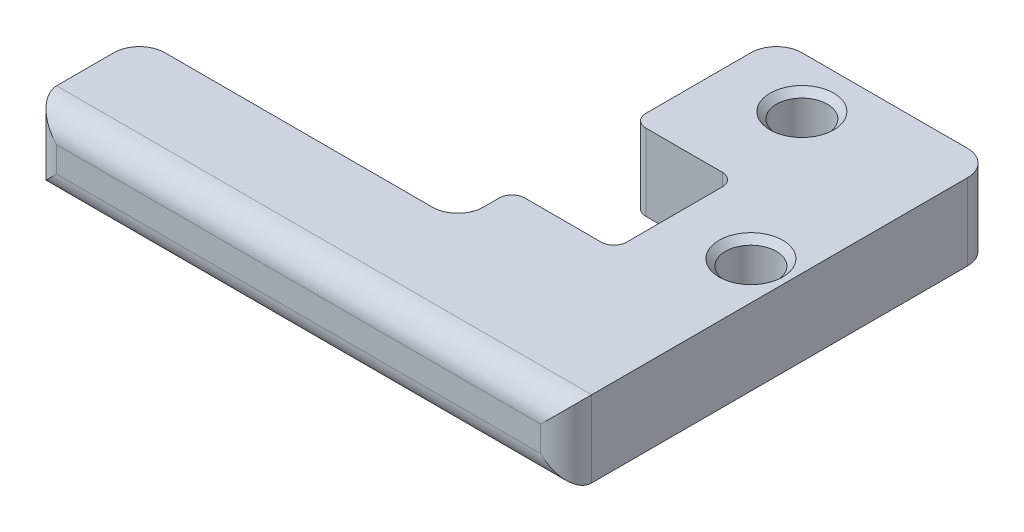
ISO-10303-21;
HEADER;
FILE_DESCRIPTION(('STEP AP214'),'2;1');
FILE_NAME('part.step','',(''),(''),'','','');
FILE_SCHEMA(('AUTOMOTIVE_DESIGN { 1 0 10303 214 1 1 1 1 }'));
ENDSEC;
DATA;
#1=APPLICATION_CONTEXT('core data for automotive mechanical design processes');
#2=APPLICATION_PROTOCOL_DEFINITION('international standard','automotive_design',2000,#1);
#3=PRODUCT_CONTEXT('',#1,'mechanical');
#4=PRODUCT('Part','Part','',(#3));
#5=PRODUCT_RELATED_PRODUCT_CATEGORY('part','',(#4));
#6=PRODUCT_DEFINITION_FORMATION('','',#4);
#7=PRODUCT_DEFINITION_CONTEXT('part definition',#1,'design');
#8=PRODUCT_DEFINITION('design','',#6,#7);
#9=PRODUCT_DEFINITION_SHAPE('','',#8);
#10=(LENGTH_UNIT() NAMED_UNIT(*) SI_UNIT(.MILLI.,.METRE.));
#11=(NAMED_UNIT(*) PLANE_ANGLE_UNIT() SI_UNIT($,.RADIAN.));
#12=(NAMED_UNIT(*) SI_UNIT($,.STERADIAN.) SOLID_ANGLE_UNIT());
#13=UNCERTAINTY_MEASURE_WITH_UNIT(LENGTH_MEASURE(1.E-05),#10,'distance_accuracy_value','');
#14=(GEOMETRIC_REPRESENTATION_CONTEXT(3) GLOBAL_UNCERTAINTY_ASSIGNED_CONTEXT((#13)) GLOBAL_UNIT_ASSIGNED_CONTEXT((#10,
#11,#12)) REPRESENTATION_CONTEXT('',''));
#15=CARTESIAN_POINT('',(0.,0.,0.));
#16=DIRECTION('',(0.,0.,1.));
#17=DIRECTION('',(1.,0.,0.));
#18=AXIS2_PLACEMENT_3D('',#15,#16,#17);
#19=CARTESIAN_POINT('',(-8.5,6.,0.));
#20=DIRECTION('',(1.,0.,0.));
#21=DIRECTION('',(0.,0.,-1.));
#22=AXIS2_PLACEMENT_3D('',#19,#20,#21);
#23=PLANE('',#22);
#24=DIRECTION('',(0.,0.,1.));
#25=VECTOR('',#24,1.);
#26=CARTESIAN_POINT('',(-8.5,6.,0.));
#27=LINE('',#26,#25);
#28=CARTESIAN_POINT('',(-8.5,6.,9.25000000000001));
#29=VERTEX_POINT('',#28);
#30=CARTESIAN_POINT('',(-8.5,6.,10.5));
#31=VERTEX_POINT('',#30);
#32=EDGE_CURVE('E381',#29,#31,#27,.T.);
#33=ORIENTED_EDGE('',*,*,#32,.F.);
#34=DIRECTION('',(0.,1.,0.));
#35=VECTOR('',#34,1.);
#36=CARTESIAN_POINT('',(-8.5,6.,9.25000000000001));
#37=LINE('',#36,#35);
#38=CARTESIAN_POINT('',(-8.5,0.,9.25000000000001));
#39=VERTEX_POINT('',#38);
#40=EDGE_CURVE('E72',#29,#39,#37,.F.);
#41=ORIENTED_EDGE('',*,*,#40,.T.);
#42=DIRECTION('',(0.,0.,1.));
#43=VECTOR('',#42,1.);
#44=CARTESIAN_POINT('',(-8.5,0.,0.));
#45=LINE('',#44,#43);
#46=CARTESIAN_POINT('',(-8.5,0.,10.5));
#47=VERTEX_POINT('',#46);
#48=EDGE_CURVE('E393',#39,#47,#45,.T.);
#49=ORIENTED_EDGE('',*,*,#48,.T.);
#50=DIRECTION('',(0.,-1.,0.));
#51=VECTOR('',#50,1.);
#52=CARTESIAN_POINT('',(-8.5,6.,10.5));
#53=LINE('',#52,#51);
#54=EDGE_CURVE('E244',#47,#31,#53,.F.);
#55=ORIENTED_EDGE('',*,*,#54,.T.);
#56=EDGE_LOOP('',(#33,#41,#49,#55));
#57=FACE_BOUND('',#56,.T.);
#58=ADVANCED_FACE('F49',(#57),#23,.F.);
#59=CARTESIAN_POINT('',(0.,6.,12.5));
#60=DIRECTION('',(0.,0.,1.));
#61=DIRECTION('',(1.,0.,0.));
#62=AXIS2_PLACEMENT_3D('',#59,#60,#61);
#63=PLANE('',#62);
#64=DIRECTION('',(-1.,0.,0.));
#65=VECTOR('',#64,1.);
#66=CARTESIAN_POINT('',(0.,6.,12.5));
#67=LINE('',#66,#65);
#68=CARTESIAN_POINT('',(-10.5,6.,12.5));
#69=VERTEX_POINT('',#68);
#70=CARTESIAN_POINT('',(-31.5,6.,12.5));
#71=VERTEX_POINT('',#70);
#72=EDGE_CURVE('E370',#69,#71,#67,.T.);
#73=ORIENTED_EDGE('',*,*,#72,.F.);
#74=DIRECTION('',(0.,-1.,0.));
#75=VECTOR('',#74,1.);
#76=CARTESIAN_POINT('',(-10.5,0.,12.5));
#77=LINE('',#76,#75);
#78=CARTESIAN_POINT('',(-10.5,0.,12.5));
#79=VERTEX_POINT('',#78);
#80=EDGE_CURVE('E238',#69,#79,#77,.T.);
#81=ORIENTED_EDGE('',*,*,#80,.T.);
#82=DIRECTION('',(-1.,0.,0.));
#83=VECTOR('',#82,1.);
#84=CARTESIAN_POINT('',(0.,0.,12.5));
#85=LINE('',#84,#83);
#86=CARTESIAN_POINT('',(-31.5,0.,12.5));
#87=VERTEX_POINT('',#86);
#88=EDGE_CURVE('E236',#79,#87,#85,.T.);
#89=ORIENTED_EDGE('',*,*,#88,.T.);
#90=DIRECTION('',(0.,-1.,0.));
#91=VECTOR('',#90,1.);
#92=CARTESIAN_POINT('',(-31.5,6.,12.5));
#93=LINE('',#92,#91);
#94=EDGE_CURVE('E229',#87,#71,#93,.F.);
#95=ORIENTED_EDGE('',*,*,#94,.T.);
#96=EDGE_LOOP('',(#73,#81,#89,#95));
#97=FACE_BOUND('',#96,.T.);
#98=ADVANCED_FACE('F436',(#97),#63,.F.);
#99=CARTESIAN_POINT('',(-33.5,6.,0.));
#100=DIRECTION('',(1.,0.,0.));
#101=DIRECTION('',(0.,0.,-1.));
#102=AXIS2_PLACEMENT_3D('',#99,#100,#101);
#103=PLANE('',#102);
#104=DIRECTION('',(0.,0.,1.));
#105=VECTOR('',#104,1.);
#106=CARTESIAN_POINT('',(-33.5,6.,0.));
#107=LINE('',#106,#105);
#108=CARTESIAN_POINT('',(-33.5,6.,14.5));
#109=VERTEX_POINT('',#108);
#110=CARTESIAN_POINT('',(-33.5,6.,19.));
#111=VERTEX_POINT('',#110);
#112=EDGE_CURVE('E373',#109,#111,#107,.T.);
#113=ORIENTED_EDGE('',*,*,#112,.F.);
#114=DIRECTION('',(0.,-1.,0.));
#115=VECTOR('',#114,1.);
#116=CARTESIAN_POINT('',(-33.5,6.,14.5));
#117=LINE('',#116,#115);
#118=CARTESIAN_POINT('',(-33.5,0.,14.5));
#119=VERTEX_POINT('',#118);
#120=EDGE_CURVE('E266',#109,#119,#117,.T.);
#121=ORIENTED_EDGE('',*,*,#120,.T.);
#122=DIRECTION('',(0.,0.,1.));
#123=VECTOR('',#122,1.);
#124=CARTESIAN_POINT('',(-33.5,0.,0.));
#125=LINE('',#124,#123);
#126=CARTESIAN_POINT('',(-33.5,0.,19.));
#127=VERTEX_POINT('',#126);
#128=EDGE_CURVE('E386',#119,#127,#125,.T.);
#129=ORIENTED_EDGE('',*,*,#128,.T.);
#130=DIRECTION('',(0.,-1.,0.));
#131=VECTOR('',#130,1.);
#132=CARTESIAN_POINT('',(-33.5,6.,19.));
#133=LINE('',#132,#131);
#134=EDGE_CURVE('E196',#127,#111,#133,.F.);
#135=ORIENTED_EDGE('',*,*,#134,.T.);
#136=EDGE_LOOP('',(#113,#121,#129,#135));
#137=FACE_BOUND('',#136,.T.);
#138=ADVANCED_FACE('F404',(#137),#103,.F.);
#139=CARTESIAN_POINT('',(0.,6.,21.));
#140=DIRECTION('',(0.,0.,1.));
#141=DIRECTION('',(1.,0.,0.));
#142=AXIS2_PLACEMENT_3D('',#139,#140,#141);
#143=PLANE('',#142);
#144=DIRECTION('',(-1.,0.,0.));
#145=VECTOR('',#144,1.);
#146=CARTESIAN_POINT('',(0.,4.,21.));
#147=LINE('',#146,#145);
#148=CARTESIAN_POINT('',(6.5,4.,21.));
#149=VERTEX_POINT('',#148);
#150=CARTESIAN_POINT('',(-31.5,4.,21.));
#151=VERTEX_POINT('',#150);
#152=EDGE_CURVE('E214',#149,#151,#147,.T.);
#153=ORIENTED_EDGE('',*,*,#152,.T.);
#154=DIRECTION('',(0.,-1.,0.));
#155=VECTOR('',#154,1.);
#156=CARTESIAN_POINT('',(-31.5,0.,21.));
#157=LINE('',#156,#155);
#158=CARTESIAN_POINT('',(-31.5,2.,21.));
#159=VERTEX_POINT('',#158);
#160=EDGE_CURVE('E194',#151,#159,#157,.T.);
#161=ORIENTED_EDGE('',*,*,#160,.T.);
#162=DIRECTION('',(-1.,0.,0.));
#163=VECTOR('',#162,1.);
#164=CARTESIAN_POINT('',(8.5,2.,21.));
#165=LINE('',#164,#163);
#166=CARTESIAN_POINT('',(6.5,2.,21.));
#167=VERTEX_POINT('',#166);
#168=EDGE_CURVE('E203',#159,#167,#165,.F.);
#169=ORIENTED_EDGE('',*,*,#168,.T.);
#170=DIRECTION('',(0.,-1.,0.));
#171=VECTOR('',#170,1.);
#172=CARTESIAN_POINT('',(6.5,6.,21.));
#173=LINE('',#172,#171);
#174=EDGE_CURVE('E209',#167,#149,#173,.F.);
#175=ORIENTED_EDGE('',*,*,#174,.T.);
#176=EDGE_LOOP('',(#153,#161,#169,#175));
#177=FACE_BOUND('',#176,.T.);
#178=ADVANCED_FACE('F212',(#177),#143,.T.);
#179=CARTESIAN_POINT('',(8.50000000000001,6.,0.));
#180=DIRECTION('',(1.,0.,0.));
#181=DIRECTION('',(0.,0.,-1.));
#182=AXIS2_PLACEMENT_3D('',#179,#180,#181);
#183=PLANE('',#182);
#184=DIRECTION('',(0.,0.,1.));
#185=VECTOR('',#184,1.);
#186=CARTESIAN_POINT('',(8.50000000000001,0.,0.));
#187=LINE('',#186,#185);
#188=CARTESIAN_POINT('',(8.50000000000001,0.,-10.5));
#189=VERTEX_POINT('',#188);
#190=CARTESIAN_POINT('',(8.5,0.,19.));
#191=VERTEX_POINT('',#190);
#192=EDGE_CURVE('E388',#189,#191,#187,.T.);
#193=ORIENTED_EDGE('',*,*,#192,.F.);
#194=DIRECTION('',(0.,-1.,0.));
#195=VECTOR('',#194,1.);
#196=CARTESIAN_POINT('',(8.50000000000001,6.,-10.5));
#197=LINE('',#196,#195);
#198=CARTESIAN_POINT('',(8.50000000000001,6.,-10.5));
#199=VERTEX_POINT('',#198);
#200=EDGE_CURVE('E264',#189,#199,#197,.F.);
#201=ORIENTED_EDGE('',*,*,#200,.T.);
#202=DIRECTION('',(0.,0.,1.));
#203=VECTOR('',#202,1.);
#204=CARTESIAN_POINT('',(8.50000000000001,6.,0.));
#205=LINE('',#204,#203);
#206=CARTESIAN_POINT('',(8.5,6.,19.));
#207=VERTEX_POINT('',#206);
#208=EDGE_CURVE('E376',#199,#207,#205,.T.);
#209=ORIENTED_EDGE('',*,*,#208,.T.);
#210=DIRECTION('',(0.,-1.,0.));
#211=VECTOR('',#210,1.);
#212=CARTESIAN_POINT('',(8.5,6.,19.));
#213=LINE('',#212,#211);
#214=EDGE_CURVE('E224',#207,#191,#213,.T.);
#215=ORIENTED_EDGE('',*,*,#214,.T.);
#216=EDGE_LOOP('',(#193,#201,#209,#215));
#217=FACE_BOUND('',#216,.T.);
#218=ADVANCED_FACE('F410',(#217),#183,.T.);
#219=CARTESIAN_POINT('',(0.,6.,-12.5));
#220=DIRECTION('',(0.,0.,-1.));
#221=DIRECTION('',(-1.,0.,0.));
#222=AXIS2_PLACEMENT_3D('',#219,#220,#221);
#223=PLANE('',#222);
#224=DIRECTION('',(1.,0.,0.));
#225=VECTOR('',#224,1.);
#226=CARTESIAN_POINT('',(0.,0.,-12.5));
#227=LINE('',#226,#225);
#228=CARTESIAN_POINT('',(-6.5,0.,-12.5));
#229=VERTEX_POINT('',#228);
#230=CARTESIAN_POINT('',(6.50000000000001,0.,-12.5));
#231=VERTEX_POINT('',#230);
#232=EDGE_CURVE('E390',#229,#231,#227,.T.);
#233=ORIENTED_EDGE('',*,*,#232,.F.);
#234=DIRECTION('',(0.,-1.,0.));
#235=VECTOR('',#234,1.);
#236=CARTESIAN_POINT('',(-6.5,6.,-12.5));
#237=LINE('',#236,#235);
#238=CARTESIAN_POINT('',(-6.5,6.,-12.5));
#239=VERTEX_POINT('',#238);
#240=EDGE_CURVE('E256',#229,#239,#237,.F.);
#241=ORIENTED_EDGE('',*,*,#240,.T.);
#242=DIRECTION('',(1.,0.,0.));
#243=VECTOR('',#242,1.);
#244=CARTESIAN_POINT('',(0.,6.,-12.5));
#245=LINE('',#244,#243);
#246=CARTESIAN_POINT('',(6.50000000000001,6.,-12.5));
#247=VERTEX_POINT('',#246);
#248=EDGE_CURVE('E378',#239,#247,#245,.T.);
#249=ORIENTED_EDGE('',*,*,#248,.T.);
#250=DIRECTION('',(0.,-1.,0.));
#251=VECTOR('',#250,1.);
#252=CARTESIAN_POINT('',(6.50000000000001,6.,-12.5));
#253=LINE('',#252,#251);
#254=EDGE_CURVE('E253',#247,#231,#253,.T.);
#255=ORIENTED_EDGE('',*,*,#254,.T.);
#256=EDGE_LOOP('',(#233,#241,#249,#255));
#257=FACE_BOUND('',#256,.T.);
#258=ADVANCED_FACE('F418',(#257),#223,.T.);
#259=CARTESIAN_POINT('',(-8.5,0.,-10.5));
#260=VERTEX_POINT('',#259);
#261=CARTESIAN_POINT('',(-8.5,0.,-2.25));
#262=VERTEX_POINT('',#261);
#263=EDGE_CURVE('E374',#260,#262,#45,.T.);
#264=ORIENTED_EDGE('',*,*,#263,.T.);
#265=DIRECTION('',(0.,1.,0.));
#266=VECTOR('',#265,1.);
#267=CARTESIAN_POINT('',(-8.5,6.,-2.25));
#268=LINE('',#267,#266);
#269=CARTESIAN_POINT('',(-8.5,6.,-2.25));
#270=VERTEX_POINT('',#269);
#271=EDGE_CURVE('E321',#262,#270,#268,.T.);
#272=ORIENTED_EDGE('',*,*,#271,.T.);
#273=CARTESIAN_POINT('',(-8.5,6.,-10.5));
#274=VERTEX_POINT('',#273);
#275=EDGE_CURVE('E210',#274,#270,#27,.T.);
#276=ORIENTED_EDGE('',*,*,#275,.F.);
#277=DIRECTION('',(0.,-1.,0.));
#278=VECTOR('',#277,1.);
#279=CARTESIAN_POINT('',(-8.5,0.,-10.5));
#280=LINE('',#279,#278);
#281=EDGE_CURVE('E241',#274,#260,#280,.T.);
#282=ORIENTED_EDGE('',*,*,#281,.T.);
#283=EDGE_LOOP('',(#264,#272,#276,#282));
#284=FACE_BOUND('',#283,.T.);
#285=ADVANCED_FACE('F426',(#284),#23,.F.);
#286=CARTESIAN_POINT('',(0.,6.,0.));
#287=DIRECTION('',(0.,1.,0.));
#288=DIRECTION('',(0.,0.,1.));
#289=AXIS2_PLACEMENT_3D('',#286,#287,#288);
#290=PLANE('',#289);
#291=DIRECTION('',(1.,0.,0.));
#292=VECTOR('',#291,1.);
#293=CARTESIAN_POINT('',(-8.5,6.,8.25));
#294=LINE('',#293,#292);
#295=CARTESIAN_POINT('',(-7.5,6.,8.25));
#296=VERTEX_POINT('',#295);
#297=CARTESIAN_POINT('',(-1.5,6.,8.25));
#298=VERTEX_POINT('',#297);
#299=EDGE_CURVE('E360',#296,#298,#294,.T.);
#300=ORIENTED_EDGE('',*,*,#299,.F.);
#301=CARTESIAN_POINT('',(-7.5,6.,9.25000000000001));
#302=DIRECTION('',(0.,1.,0.));
#303=DIRECTION('',(0.,0.,1.));
#304=AXIS2_PLACEMENT_3D('',#301,#302,#303);
#305=CIRCLE('',#304,1.);
#306=EDGE_CURVE('E315',#296,#29,#305,.T.);
#307=ORIENTED_EDGE('',*,*,#306,.T.);
#308=ORIENTED_EDGE('',*,*,#32,.T.);
#309=CARTESIAN_POINT('',(-10.5,6.,10.5));
#310=DIRECTION('',(0.,1.,0.));
#311=DIRECTION('',(0.,0.,1.));
#312=AXIS2_PLACEMENT_3D('',#309,#310,#311);
#313=CIRCLE('',#312,2.);
#314=EDGE_CURVE('E272',#31,#69,#313,.F.);
#315=ORIENTED_EDGE('',*,*,#314,.T.);
#316=ORIENTED_EDGE('',*,*,#72,.T.);
#317=CARTESIAN_POINT('',(-31.5,6.,14.5));
#318=DIRECTION('',(0.,1.,0.));
#319=DIRECTION('',(0.,0.,1.));
#320=AXIS2_PLACEMENT_3D('',#317,#318,#319);
#321=CIRCLE('',#320,2.);
#322=EDGE_CURVE('E258',#71,#109,#321,.T.);
#323=ORIENTED_EDGE('',*,*,#322,.T.);
#324=ORIENTED_EDGE('',*,*,#112,.T.);
#325=DIRECTION('',(-1.,0.,0.));
#326=VECTOR('',#325,1.);
#327=CARTESIAN_POINT('',(0.,6.,19.));
#328=LINE('',#327,#326);
#329=EDGE_CURVE('E217',#111,#207,#328,.F.);
#330=ORIENTED_EDGE('',*,*,#329,.T.);
#331=ORIENTED_EDGE('',*,*,#208,.F.);
#332=CARTESIAN_POINT('',(6.50000000000001,6.,-10.5));
#333=DIRECTION('',(0.,1.,0.));
#334=DIRECTION('',(0.,0.,1.));
#335=AXIS2_PLACEMENT_3D('',#332,#333,#334);
#336=CIRCLE('',#335,2.);
#337=EDGE_CURVE('E260',#199,#247,#336,.T.);
#338=ORIENTED_EDGE('',*,*,#337,.T.);
#339=ORIENTED_EDGE('',*,*,#248,.F.);
#340=CARTESIAN_POINT('',(-6.5,6.,-10.5));
#341=DIRECTION('',(0.,1.,0.));
#342=DIRECTION('',(0.,0.,1.));
#343=AXIS2_PLACEMENT_3D('',#340,#341,#342);
#344=CIRCLE('',#343,2.);
#345=EDGE_CURVE('E262',#239,#274,#344,.T.);
#346=ORIENTED_EDGE('',*,*,#345,.T.);
#347=ORIENTED_EDGE('',*,*,#275,.T.);
#348=CARTESIAN_POINT('',(-7.5,6.,-2.25));
#349=DIRECTION('',(0.,1.,0.));
#350=DIRECTION('',(0.,0.,1.));
#351=AXIS2_PLACEMENT_3D('',#348,#349,#350);
#352=CIRCLE('',#351,1.);
#353=CARTESIAN_POINT('',(-7.5,6.,-1.25));
#354=VERTEX_POINT('',#353);
#355=EDGE_CURVE('E313',#270,#354,#352,.T.);
#356=ORIENTED_EDGE('',*,*,#355,.T.);
#357=DIRECTION('',(-1.,0.,0.));
#358=VECTOR('',#357,1.);
#359=CARTESIAN_POINT('',(-8.5,6.,-1.25));
#360=LINE('',#359,#358);
#361=CARTESIAN_POINT('',(-1.5,6.,-1.25));
#362=VERTEX_POINT('',#361);
#363=EDGE_CURVE('E336',#362,#354,#360,.T.);
#364=ORIENTED_EDGE('',*,*,#363,.F.);
#365=CARTESIAN_POINT('',(-1.5,6.,-0.249999999999995));
#366=DIRECTION('',(0.,1.,0.));
#367=DIRECTION('',(0.,0.,1.));
#368=AXIS2_PLACEMENT_3D('',#365,#366,#367);
#369=CIRCLE('',#368,1.);
#370=CARTESIAN_POINT('',(-0.499999999999999,6.,-0.249999999999996));
#371=VERTEX_POINT('',#370);
#372=EDGE_CURVE('E57',#362,#371,#369,.F.);
#373=ORIENTED_EDGE('',*,*,#372,.T.);
#374=DIRECTION('',(0.,0.,-1.));
#375=VECTOR('',#374,1.);
#376=CARTESIAN_POINT('',(-0.5,6.,-1.25));
#377=LINE('',#376,#375);
#378=CARTESIAN_POINT('',(-0.499999999999998,6.,7.25));
#379=VERTEX_POINT('',#378);
#380=EDGE_CURVE('E334',#379,#371,#377,.T.);
#381=ORIENTED_EDGE('',*,*,#380,.F.);
#382=CARTESIAN_POINT('',(-1.5,6.,7.25));
#383=DIRECTION('',(0.,1.,0.));
#384=DIRECTION('',(0.,0.,1.));
#385=AXIS2_PLACEMENT_3D('',#382,#383,#384);
#386=CIRCLE('',#385,1.);
#387=EDGE_CURVE('E324',#379,#298,#386,.F.);
#388=ORIENTED_EDGE('',*,*,#387,.T.);
#389=EDGE_LOOP('',(#300,#307,#308,#315,#316,#323,#324,#330,#331,#338,#339,#346,#347,#356,#364,
#373,#381,#388));
#390=FACE_BOUND('',#389,.T.);
#391=CARTESIAN_POINT('',(5.5,6.,3.5));
#392=DIRECTION('',(0.,1.,0.));
#393=DIRECTION('',(0.,0.,1.));
#394=AXIS2_PLACEMENT_3D('',#391,#392,#393);
#395=CIRCLE('',#394,2.50000000000001);
#396=CARTESIAN_POINT('',(5.5,6.,6.00000000000001));
#397=VERTEX_POINT('',#396);
#398=EDGE_CURVE('E286',#397,#397,#395,.F.);
#399=ORIENTED_EDGE('',*,*,#398,.T.);
#400=EDGE_LOOP('',(#399));
#401=FACE_BOUND('',#400,.T.);
#402=CARTESIAN_POINT('',(-2.5,6.,-8.5));
#403=DIRECTION('',(0.,1.,0.));
#404=DIRECTION('',(0.,0.,1.));
#405=AXIS2_PLACEMENT_3D('',#402,#403,#404);
#406=CIRCLE('',#405,2.50000000000001);
#407=CARTESIAN_POINT('',(-2.5,6.,-5.99999999999999));
#408=VERTEX_POINT('',#407);
#409=EDGE_CURVE('E283',#408,#408,#406,.F.);
#410=ORIENTED_EDGE('',*,*,#409,.T.);
#411=EDGE_LOOP('',(#410));
#412=FACE_BOUND('',#411,.T.);
#413=ADVANCED_FACE('F332',(#390,#401,#412),#290,.T.);
#414=CARTESIAN_POINT('',(0.,0.,0.));
#415=DIRECTION('',(0.,1.,0.));
#416=DIRECTION('',(0.,0.,1.));
#417=AXIS2_PLACEMENT_3D('',#414,#415,#416);
#418=PLANE('',#417);
#419=CARTESIAN_POINT('',(-2.5,0.,-8.5));
#420=DIRECTION('',(0.,1.,0.));
#421=DIRECTION('',(0.,0.,1.));
#422=AXIS2_PLACEMENT_3D('',#419,#420,#421);
#423=CIRCLE('',#422,2.5);
#424=CARTESIAN_POINT('',(-2.5,0.,-6.));
#425=VERTEX_POINT('',#424);
#426=EDGE_CURVE('E278',#425,#425,#423,.T.);
#427=ORIENTED_EDGE('',*,*,#426,.T.);
#428=EDGE_LOOP('',(#427));
#429=FACE_BOUND('',#428,.T.);
#430=CARTESIAN_POINT('',(5.5,0.,3.5));
#431=DIRECTION('',(0.,1.,0.));
#432=DIRECTION('',(0.,0.,1.));
#433=AXIS2_PLACEMENT_3D('',#430,#431,#432);
#434=CIRCLE('',#433,2.5);
#435=CARTESIAN_POINT('',(5.5,0.,6.));
#436=VERTEX_POINT('',#435);
#437=EDGE_CURVE('E358',#436,#436,#434,.T.);
#438=ORIENTED_EDGE('',*,*,#437,.T.);
#439=EDGE_LOOP('',(#438));
#440=FACE_BOUND('',#439,.T.);
#441=ORIENTED_EDGE('',*,*,#48,.F.);
#442=CARTESIAN_POINT('',(-7.5,0.,9.25000000000001));
#443=DIRECTION('',(0.,1.,0.));
#444=DIRECTION('',(0.,0.,1.));
#445=AXIS2_PLACEMENT_3D('',#442,#443,#444);
#446=CIRCLE('',#445,1.);
#447=CARTESIAN_POINT('',(-7.5,0.,8.25));
#448=VERTEX_POINT('',#447);
#449=EDGE_CURVE('E319',#39,#448,#446,.F.);
#450=ORIENTED_EDGE('',*,*,#449,.T.);
#451=DIRECTION('',(1.,0.,0.));
#452=VECTOR('',#451,1.);
#453=CARTESIAN_POINT('',(-8.5,0.,8.25));
#454=LINE('',#453,#452);
#455=CARTESIAN_POINT('',(-1.5,0.,8.25));
#456=VERTEX_POINT('',#455);
#457=EDGE_CURVE('E355',#448,#456,#454,.T.);
#458=ORIENTED_EDGE('',*,*,#457,.T.);
#459=CARTESIAN_POINT('',(-1.5,0.,7.25));
#460=DIRECTION('',(0.,1.,0.));
#461=DIRECTION('',(0.,0.,1.));
#462=AXIS2_PLACEMENT_3D('',#459,#460,#461);
#463=CIRCLE('',#462,1.);
#464=CARTESIAN_POINT('',(-0.499999999999998,0.,7.25));
#465=VERTEX_POINT('',#464);
#466=EDGE_CURVE('E326',#456,#465,#463,.T.);
#467=ORIENTED_EDGE('',*,*,#466,.T.);
#468=DIRECTION('',(0.,0.,-1.));
#469=VECTOR('',#468,1.);
#470=CARTESIAN_POINT('',(-0.5,0.,-1.25));
#471=LINE('',#470,#469);
#472=CARTESIAN_POINT('',(-0.499999999999999,0.,-0.249999999999996));
#473=VERTEX_POINT('',#472);
#474=EDGE_CURVE('E351',#465,#473,#471,.T.);
#475=ORIENTED_EDGE('',*,*,#474,.T.);
#476=CARTESIAN_POINT('',(-1.5,0.,-0.249999999999995));
#477=DIRECTION('',(0.,1.,0.));
#478=DIRECTION('',(0.,0.,1.));
#479=AXIS2_PLACEMENT_3D('',#476,#477,#478);
#480=CIRCLE('',#479,1.);
#481=CARTESIAN_POINT('',(-1.5,0.,-1.25));
#482=VERTEX_POINT('',#481);
#483=EDGE_CURVE('E11',#473,#482,#480,.T.);
#484=ORIENTED_EDGE('',*,*,#483,.T.);
#485=DIRECTION('',(-1.,0.,0.));
#486=VECTOR('',#485,1.);
#487=CARTESIAN_POINT('',(-8.5,0.,-1.25));
#488=LINE('',#487,#486);
#489=CARTESIAN_POINT('',(-7.5,0.,-1.25));
#490=VERTEX_POINT('',#489);
#491=EDGE_CURVE('E350',#482,#490,#488,.T.);
#492=ORIENTED_EDGE('',*,*,#491,.T.);
#493=CARTESIAN_POINT('',(-7.5,0.,-2.25));
#494=DIRECTION('',(0.,1.,0.));
#495=DIRECTION('',(0.,0.,1.));
#496=AXIS2_PLACEMENT_3D('',#493,#494,#495);
#497=CIRCLE('',#496,1.);
#498=EDGE_CURVE('E64',#490,#262,#497,.F.);
#499=ORIENTED_EDGE('',*,*,#498,.T.);
#500=ORIENTED_EDGE('',*,*,#263,.F.);
#501=CARTESIAN_POINT('',(-6.5,0.,-10.5));
#502=DIRECTION('',(0.,1.,0.));
#503=DIRECTION('',(0.,0.,1.));
#504=AXIS2_PLACEMENT_3D('',#501,#502,#503);
#505=CIRCLE('',#504,2.);
#506=EDGE_CURVE('E251',#260,#229,#505,.F.);
#507=ORIENTED_EDGE('',*,*,#506,.T.);
#508=ORIENTED_EDGE('',*,*,#232,.T.);
#509=CARTESIAN_POINT('',(6.50000000000001,0.,-10.5));
#510=DIRECTION('',(0.,1.,0.));
#511=DIRECTION('',(0.,0.,1.));
#512=AXIS2_PLACEMENT_3D('',#509,#510,#511);
#513=CIRCLE('',#512,2.);
#514=EDGE_CURVE('E249',#231,#189,#513,.F.);
#515=ORIENTED_EDGE('',*,*,#514,.T.);
#516=ORIENTED_EDGE('',*,*,#192,.T.);
#517=DIRECTION('',(-1.,0.,0.));
#518=VECTOR('',#517,1.);
#519=CARTESIAN_POINT('',(-33.5,0.,19.));
#520=LINE('',#519,#518);
#521=EDGE_CURVE('E227',#191,#127,#520,.T.);
#522=ORIENTED_EDGE('',*,*,#521,.T.);
#523=ORIENTED_EDGE('',*,*,#128,.F.);
#524=CARTESIAN_POINT('',(-31.5,0.,14.5));
#525=DIRECTION('',(0.,1.,0.));
#526=DIRECTION('',(0.,0.,1.));
#527=AXIS2_PLACEMENT_3D('',#524,#525,#526);
#528=CIRCLE('',#527,2.);
#529=EDGE_CURVE('E247',#119,#87,#528,.F.);
#530=ORIENTED_EDGE('',*,*,#529,.T.);
#531=ORIENTED_EDGE('',*,*,#88,.F.);
#532=CARTESIAN_POINT('',(-10.5,0.,10.5));
#533=DIRECTION('',(0.,1.,0.));
#534=DIRECTION('',(0.,0.,1.));
#535=AXIS2_PLACEMENT_3D('',#532,#533,#534);
#536=CIRCLE('',#535,2.);
#537=EDGE_CURVE('E269',#79,#47,#536,.T.);
#538=ORIENTED_EDGE('',*,*,#537,.T.);
#539=EDGE_LOOP('',(#441,#450,#458,#467,#475,#484,#492,#499,#500,#507,#508,#515,#516,#522,#523,
#530,#531,#538));
#540=FACE_BOUND('',#539,.T.);
#541=ADVANCED_FACE('F349',(#429,#440,#540),#418,.F.);
#542=CARTESIAN_POINT('',(5.5,0.,3.5));
#543=DIRECTION('',(0.,1.,0.));
#544=DIRECTION('',(0.,0.,1.));
#545=AXIS2_PLACEMENT_3D('',#542,#543,#544);
#546=CYLINDRICAL_SURFACE('',#545,2.);
#547=CARTESIAN_POINT('',(5.5,5.49999999999999,3.5));
#548=DIRECTION('',(0.,1.,0.));
#549=DIRECTION('',(0.,0.,1.));
#550=AXIS2_PLACEMENT_3D('',#547,#548,#549);
#551=CIRCLE('',#550,2.);
#552=CARTESIAN_POINT('',(5.5,5.49999999999999,5.5));
#553=VERTEX_POINT('',#552);
#554=EDGE_CURVE('E274',#553,#553,#551,.T.);
#555=ORIENTED_EDGE('',*,*,#554,.T.);
#556=EDGE_LOOP('',(#555));
#557=FACE_BOUND('',#556,.T.);
#558=CARTESIAN_POINT('',(5.5,2.,3.5));
#559=DIRECTION('',(0.,1.,0.));
#560=DIRECTION('',(0.,0.,1.));
#561=AXIS2_PLACEMENT_3D('',#558,#559,#560);
#562=CIRCLE('',#561,2.);
#563=CARTESIAN_POINT('',(5.5,2.,5.5));
#564=VERTEX_POINT('',#563);
#565=EDGE_CURVE('E200',#564,#564,#562,.F.);
#566=ORIENTED_EDGE('',*,*,#565,.T.);
#567=EDGE_LOOP('',(#566));
#568=FACE_BOUND('',#567,.T.);
#569=ADVANCED_FACE('F640',(#557,#568),#546,.F.);
#570=CARTESIAN_POINT('',(-2.5,0.,-8.5));
#571=DIRECTION('',(0.,1.,0.));
#572=DIRECTION('',(0.,0.,1.));
#573=AXIS2_PLACEMENT_3D('',#570,#571,#572);
#574=CYLINDRICAL_SURFACE('',#573,2.);
#575=CARTESIAN_POINT('',(-2.5,5.49999999999999,-8.5));
#576=DIRECTION('',(0.,1.,0.));
#577=DIRECTION('',(0.,0.,1.));
#578=AXIS2_PLACEMENT_3D('',#575,#576,#577);
#579=CIRCLE('',#578,2.);
#580=CARTESIAN_POINT('',(-2.5,5.49999999999999,-6.5));
#581=VERTEX_POINT('',#580);
#582=EDGE_CURVE('E289',#581,#581,#579,.T.);
#583=ORIENTED_EDGE('',*,*,#582,.T.);
#584=EDGE_LOOP('',(#583));
#585=FACE_BOUND('',#584,.T.);
#586=CARTESIAN_POINT('',(-2.5,2.,-8.5));
#587=DIRECTION('',(0.,1.,0.));
#588=DIRECTION('',(0.,0.,1.));
#589=AXIS2_PLACEMENT_3D('',#586,#587,#588);
#590=CIRCLE('',#589,2.);
#591=CARTESIAN_POINT('',(-2.5,2.,-6.5));
#592=VERTEX_POINT('',#591);
#593=EDGE_CURVE('E275',#592,#592,#590,.F.);
#594=ORIENTED_EDGE('',*,*,#593,.T.);
#595=EDGE_LOOP('',(#594));
#596=FACE_BOUND('',#595,.T.);
#597=ADVANCED_FACE('F471',(#585,#596),#574,.F.);
#598=CARTESIAN_POINT('',(6.5,6.,19.));
#599=DIRECTION('',(0.,-1.,0.));
#600=DIRECTION('',(0.,0.,-1.));
#601=AXIS2_PLACEMENT_3D('',#598,#599,#600);
#602=CYLINDRICAL_SURFACE('',#601,2.);
#603=CARTESIAN_POINT('',(6.5,2.,19.));
#604=DIRECTION('',(0.707106781186547,0.707106781186547,0.));
#605=DIRECTION('',(0.707106781186547,-0.707106781186547,0.));
#606=AXIS2_PLACEMENT_3D('',#603,#604,#605);
#607=ELLIPSE('',#606,2.82842712474619,2.);
#608=EDGE_CURVE('E206',#191,#167,#607,.F.);
#609=ORIENTED_EDGE('',*,*,#608,.F.);
#610=ORIENTED_EDGE('',*,*,#214,.F.);
#611=CARTESIAN_POINT('',(6.5,4.,19.));
#612=DIRECTION('',(0.707106781186547,-0.707106781186547,0.));
#613=DIRECTION('',(-0.707106781186547,-0.707106781186547,0.));
#614=AXIS2_PLACEMENT_3D('',#611,#612,#613);
#615=ELLIPSE('',#614,2.82842712474619,2.);
#616=EDGE_CURVE('E233',#149,#207,#615,.F.);
#617=ORIENTED_EDGE('',*,*,#616,.F.);
#618=ORIENTED_EDGE('',*,*,#174,.F.);
#619=EDGE_LOOP('',(#609,#610,#617,#618));
#620=FACE_BOUND('',#619,.T.);
#621=ADVANCED_FACE('F397',(#620),#602,.T.);
#622=CARTESIAN_POINT('',(0.,4.,19.));
#623=DIRECTION('',(-1.,0.,0.));
#624=DIRECTION('',(0.,0.,1.));
#625=AXIS2_PLACEMENT_3D('',#622,#623,#624);
#626=CYLINDRICAL_SURFACE('',#625,2.);
#627=ORIENTED_EDGE('',*,*,#616,.T.);
#628=ORIENTED_EDGE('',*,*,#329,.F.);
#629=CARTESIAN_POINT('',(-31.5,4.,19.));
#630=DIRECTION('',(-0.707106781186547,-0.707106781186547,0.));
#631=DIRECTION('',(-0.707106781186547,0.707106781186547,0.));
#632=AXIS2_PLACEMENT_3D('',#629,#630,#631);
#633=ELLIPSE('',#632,2.82842712474619,2.);
#634=EDGE_CURVE('E199',#151,#111,#633,.T.);
#635=ORIENTED_EDGE('',*,*,#634,.F.);
#636=ORIENTED_EDGE('',*,*,#152,.F.);
#637=EDGE_LOOP('',(#627,#628,#635,#636));
#638=FACE_BOUND('',#637,.T.);
#639=ADVANCED_FACE('F400',(#638),#626,.T.);
#640=CARTESIAN_POINT('',(0.,2.,19.));
#641=DIRECTION('',(1.,0.,0.));
#642=DIRECTION('',(0.,0.,-1.));
#643=AXIS2_PLACEMENT_3D('',#640,#641,#642);
#644=CYLINDRICAL_SURFACE('',#643,2.);
#645=ORIENTED_EDGE('',*,*,#608,.T.);
#646=ORIENTED_EDGE('',*,*,#168,.F.);
#647=CARTESIAN_POINT('',(-31.5,2.,19.));
#648=DIRECTION('',(0.707106781186547,-0.707106781186547,0.));
#649=DIRECTION('',(0.707106781186547,0.707106781186547,0.));
#650=AXIS2_PLACEMENT_3D('',#647,#648,#649);
#651=ELLIPSE('',#650,2.82842712474619,2.);
#652=EDGE_CURVE('E189',#127,#159,#651,.F.);
#653=ORIENTED_EDGE('',*,*,#652,.F.);
#654=ORIENTED_EDGE('',*,*,#521,.F.);
#655=EDGE_LOOP('',(#645,#646,#653,#654));
#656=FACE_BOUND('',#655,.T.);
#657=ADVANCED_FACE('F204',(#656),#644,.T.);
#658=CARTESIAN_POINT('',(-31.5,6.,19.));
#659=DIRECTION('',(0.,1.,0.));
#660=DIRECTION('',(0.,0.,1.));
#661=AXIS2_PLACEMENT_3D('',#658,#659,#660);
#662=CYLINDRICAL_SURFACE('',#661,2.);
#663=ORIENTED_EDGE('',*,*,#634,.T.);
#664=ORIENTED_EDGE('',*,*,#134,.F.);
#665=ORIENTED_EDGE('',*,*,#652,.T.);
#666=ORIENTED_EDGE('',*,*,#160,.F.);
#667=EDGE_LOOP('',(#663,#664,#665,#666));
#668=FACE_BOUND('',#667,.T.);
#669=ADVANCED_FACE('F192',(#668),#662,.T.);
#670=CARTESIAN_POINT('',(-10.5,6.,10.5));
#671=DIRECTION('',(0.,1.,0.));
#672=DIRECTION('',(0.,0.,1.));
#673=AXIS2_PLACEMENT_3D('',#670,#671,#672);
#674=CYLINDRICAL_SURFACE('',#673,2.);
#675=ORIENTED_EDGE('',*,*,#314,.F.);
#676=ORIENTED_EDGE('',*,*,#54,.F.);
#677=ORIENTED_EDGE('',*,*,#537,.F.);
#678=ORIENTED_EDGE('',*,*,#80,.F.);
#679=EDGE_LOOP('',(#675,#676,#677,#678));
#680=FACE_BOUND('',#679,.T.);
#681=ADVANCED_FACE('F464',(#680),#674,.F.);
#682=CARTESIAN_POINT('',(-6.5,6.,-10.5));
#683=DIRECTION('',(0.,1.,0.));
#684=DIRECTION('',(0.,0.,1.));
#685=AXIS2_PLACEMENT_3D('',#682,#683,#684);
#686=CYLINDRICAL_SURFACE('',#685,2.);
#687=ORIENTED_EDGE('',*,*,#345,.F.);
#688=ORIENTED_EDGE('',*,*,#240,.F.);
#689=ORIENTED_EDGE('',*,*,#506,.F.);
#690=ORIENTED_EDGE('',*,*,#281,.F.);
#691=EDGE_LOOP('',(#687,#688,#689,#690));
#692=FACE_BOUND('',#691,.T.);
#693=ADVANCED_FACE('F423',(#692),#686,.T.);
#694=CARTESIAN_POINT('',(6.50000000000001,6.,-10.5));
#695=DIRECTION('',(0.,-1.,0.));
#696=DIRECTION('',(0.,0.,-1.));
#697=AXIS2_PLACEMENT_3D('',#694,#695,#696);
#698=CYLINDRICAL_SURFACE('',#697,2.);
#699=ORIENTED_EDGE('',*,*,#337,.F.);
#700=ORIENTED_EDGE('',*,*,#200,.F.);
#701=ORIENTED_EDGE('',*,*,#514,.F.);
#702=ORIENTED_EDGE('',*,*,#254,.F.);
#703=EDGE_LOOP('',(#699,#700,#701,#702));
#704=FACE_BOUND('',#703,.T.);
#705=ADVANCED_FACE('F415',(#704),#698,.T.);
#706=CARTESIAN_POINT('',(-31.5,6.,14.5));
#707=DIRECTION('',(0.,-1.,0.));
#708=DIRECTION('',(0.,0.,-1.));
#709=AXIS2_PLACEMENT_3D('',#706,#707,#708);
#710=CYLINDRICAL_SURFACE('',#709,2.);
#711=ORIENTED_EDGE('',*,*,#322,.F.);
#712=ORIENTED_EDGE('',*,*,#94,.F.);
#713=ORIENTED_EDGE('',*,*,#529,.F.);
#714=ORIENTED_EDGE('',*,*,#120,.F.);
#715=EDGE_LOOP('',(#711,#712,#713,#714));
#716=FACE_BOUND('',#715,.T.);
#717=ADVANCED_FACE('F478',(#716),#710,.T.);
#718=CARTESIAN_POINT('',(-2.5,0.,-8.5));
#719=DIRECTION('',(0.,1.,0.));
#720=DIRECTION('',(0.,0.,1.));
#721=AXIS2_PLACEMENT_3D('',#718,#719,#720);
#722=CYLINDRICAL_SURFACE('',#721,2.5);
#723=CARTESIAN_POINT('',(-2.5,1.13397459621556,-8.5));
#724=DIRECTION('',(0.,1.,0.));
#725=DIRECTION('',(0.,0.,1.));
#726=AXIS2_PLACEMENT_3D('',#723,#724,#725);
#727=CIRCLE('',#726,2.5);
#728=CARTESIAN_POINT('',(-2.5,1.13397459621556,-6.));
#729=VERTEX_POINT('',#728);
#730=EDGE_CURVE('E292',#729,#729,#727,.T.);
#731=ORIENTED_EDGE('',*,*,#730,.T.);
#732=EDGE_LOOP('',(#731));
#733=FACE_BOUND('',#732,.T.);
#734=ORIENTED_EDGE('',*,*,#426,.F.);
#735=EDGE_LOOP('',(#734));
#736=FACE_BOUND('',#735,.T.);
#737=ADVANCED_FACE('F481',(#733,#736),#722,.F.);
#738=CARTESIAN_POINT('',(5.5,0.,3.5));
#739=DIRECTION('',(0.,1.,0.));
#740=DIRECTION('',(0.,0.,1.));
#741=AXIS2_PLACEMENT_3D('',#738,#739,#740);
#742=CYLINDRICAL_SURFACE('',#741,2.5);
#743=CARTESIAN_POINT('',(5.5,1.13397459621556,3.5));
#744=DIRECTION('',(0.,1.,0.));
#745=DIRECTION('',(0.,0.,1.));
#746=AXIS2_PLACEMENT_3D('',#743,#744,#745);
#747=CIRCLE('',#746,2.5);
#748=CARTESIAN_POINT('',(5.5,1.13397459621556,6.));
#749=VERTEX_POINT('',#748);
#750=EDGE_CURVE('E295',#749,#749,#747,.T.);
#751=ORIENTED_EDGE('',*,*,#750,.T.);
#752=EDGE_LOOP('',(#751));
#753=FACE_BOUND('',#752,.T.);
#754=ORIENTED_EDGE('',*,*,#437,.F.);
#755=EDGE_LOOP('',(#754));
#756=FACE_BOUND('',#755,.T.);
#757=ADVANCED_FACE('F491',(#753,#756),#742,.F.);
#758=CARTESIAN_POINT('',(5.5,5.49999999999999,3.5));
#759=DIRECTION('',(0.,1.,0.));
#760=DIRECTION('',(0.,0.,1.));
#761=AXIS2_PLACEMENT_3D('',#758,#759,#760);
#762=CONICAL_SURFACE('',#761,2.,0.785398163397448);
#763=ORIENTED_EDGE('',*,*,#398,.F.);
#764=EDGE_LOOP('',(#763));
#765=FACE_BOUND('',#764,.T.);
#766=ORIENTED_EDGE('',*,*,#554,.F.);
#767=EDGE_LOOP('',(#766));
#768=FACE_BOUND('',#767,.T.);
#769=ADVANCED_FACE('F484',(#765,#768),#762,.F.);
#770=CARTESIAN_POINT('',(-2.5,5.49999999999999,-8.5));
#771=DIRECTION('',(0.,1.,0.));
#772=DIRECTION('',(0.,0.,1.));
#773=AXIS2_PLACEMENT_3D('',#770,#771,#772);
#774=CONICAL_SURFACE('',#773,2.,0.785398163397448);
#775=ORIENTED_EDGE('',*,*,#409,.F.);
#776=EDGE_LOOP('',(#775));
#777=FACE_BOUND('',#776,.T.);
#778=ORIENTED_EDGE('',*,*,#582,.F.);
#779=EDGE_LOOP('',(#778));
#780=FACE_BOUND('',#779,.T.);
#781=ADVANCED_FACE('F490',(#777,#780),#774,.F.);
#782=CARTESIAN_POINT('',(-2.5,1.13397459621556,-8.5));
#783=DIRECTION('',(0.,1.,0.));
#784=DIRECTION('',(0.,0.,1.));
#785=AXIS2_PLACEMENT_3D('',#782,#783,#784);
#786=TOROIDAL_SURFACE('',#785,1.5,1.);
#787=ORIENTED_EDGE('',*,*,#593,.F.);
#788=EDGE_LOOP('',(#787));
#789=FACE_BOUND('',#788,.T.);
#790=ORIENTED_EDGE('',*,*,#730,.F.);
#791=EDGE_LOOP('',(#790));
#792=FACE_BOUND('',#791,.T.);
#793=ADVANCED_FACE('F497',(#789,#792),#786,.F.);
#794=CARTESIAN_POINT('',(5.5,1.13397459621556,3.5));
#795=DIRECTION('',(0.,1.,0.));
#796=DIRECTION('',(0.,0.,1.));
#797=AXIS2_PLACEMENT_3D('',#794,#795,#796);
#798=TOROIDAL_SURFACE('',#797,1.5,1.);
#799=ORIENTED_EDGE('',*,*,#565,.F.);
#800=EDGE_LOOP('',(#799));
#801=FACE_BOUND('',#800,.T.);
#802=ORIENTED_EDGE('',*,*,#750,.F.);
#803=EDGE_LOOP('',(#802));
#804=FACE_BOUND('',#803,.T.);
#805=ADVANCED_FACE('F501',(#801,#804),#798,.F.);
#806=CARTESIAN_POINT('',(-0.5,0.,-1.25));
#807=DIRECTION('',(1.,0.,0.));
#808=DIRECTION('',(0.,0.,-1.));
#809=AXIS2_PLACEMENT_3D('',#806,#807,#808);
#810=PLANE('',#809);
#811=ORIENTED_EDGE('',*,*,#474,.F.);
#812=DIRECTION('',(0.,1.,0.));
#813=VECTOR('',#812,1.);
#814=CARTESIAN_POINT('',(-0.499999999999998,6.,7.25));
#815=LINE('',#814,#813);
#816=EDGE_CURVE('E300',#465,#379,#815,.T.);
#817=ORIENTED_EDGE('',*,*,#816,.T.);
#818=ORIENTED_EDGE('',*,*,#380,.T.);
#819=DIRECTION('',(0.,1.,0.));
#820=VECTOR('',#819,1.);
#821=CARTESIAN_POINT('',(-0.499999999999999,0.,-0.249999999999996));
#822=LINE('',#821,#820);
#823=EDGE_CURVE('E298',#371,#473,#822,.F.);
#824=ORIENTED_EDGE('',*,*,#823,.T.);
#825=EDGE_LOOP('',(#811,#817,#818,#824));
#826=FACE_BOUND('',#825,.T.);
#827=ADVANCED_FACE('F342',(#826),#810,.F.);
#828=CARTESIAN_POINT('',(-8.5,0.,8.25));
#829=DIRECTION('',(0.,0.,1.));
#830=DIRECTION('',(1.,0.,0.));
#831=AXIS2_PLACEMENT_3D('',#828,#829,#830);
#832=PLANE('',#831);
#833=ORIENTED_EDGE('',*,*,#299,.T.);
#834=DIRECTION('',(0.,1.,0.));
#835=VECTOR('',#834,1.);
#836=CARTESIAN_POINT('',(-1.5,0.,8.25));
#837=LINE('',#836,#835);
#838=EDGE_CURVE('E306',#298,#456,#837,.F.);
#839=ORIENTED_EDGE('',*,*,#838,.T.);
#840=ORIENTED_EDGE('',*,*,#457,.F.);
#841=DIRECTION('',(0.,1.,0.));
#842=VECTOR('',#841,1.);
#843=CARTESIAN_POINT('',(-7.5,0.,8.25));
#844=LINE('',#843,#842);
#845=EDGE_CURVE('E303',#448,#296,#844,.T.);
#846=ORIENTED_EDGE('',*,*,#845,.T.);
#847=EDGE_LOOP('',(#833,#839,#840,#846));
#848=FACE_BOUND('',#847,.T.);
#849=ADVANCED_FACE('F537',(#848),#832,.F.);
#850=CARTESIAN_POINT('',(-8.5,0.,-1.25));
#851=DIRECTION('',(0.,0.,-1.));
#852=DIRECTION('',(-1.,0.,0.));
#853=AXIS2_PLACEMENT_3D('',#850,#851,#852);
#854=PLANE('',#853);
#855=ORIENTED_EDGE('',*,*,#491,.F.);
#856=DIRECTION('',(0.,1.,0.));
#857=VECTOR('',#856,1.);
#858=CARTESIAN_POINT('',(-1.5,6.,-1.25));
#859=LINE('',#858,#857);
#860=EDGE_CURVE('E310',#482,#362,#859,.T.);
#861=ORIENTED_EDGE('',*,*,#860,.T.);
#862=ORIENTED_EDGE('',*,*,#363,.T.);
#863=DIRECTION('',(0.,1.,0.));
#864=VECTOR('',#863,1.);
#865=CARTESIAN_POINT('',(-7.5,0.,-1.25));
#866=LINE('',#865,#864);
#867=EDGE_CURVE('E308',#354,#490,#866,.F.);
#868=ORIENTED_EDGE('',*,*,#867,.T.);
#869=EDGE_LOOP('',(#855,#861,#862,#868));
#870=FACE_BOUND('',#869,.T.);
#871=ADVANCED_FACE('F353',(#870),#854,.F.);
#872=CARTESIAN_POINT('',(-1.5,0.,7.25));
#873=DIRECTION('',(0.,-1.,0.));
#874=DIRECTION('',(0.,0.,-1.));
#875=AXIS2_PLACEMENT_3D('',#872,#873,#874);
#876=CYLINDRICAL_SURFACE('',#875,1.);
#877=ORIENTED_EDGE('',*,*,#466,.F.);
#878=ORIENTED_EDGE('',*,*,#838,.F.);
#879=ORIENTED_EDGE('',*,*,#387,.F.);
#880=ORIENTED_EDGE('',*,*,#816,.F.);
#881=EDGE_LOOP('',(#877,#878,#879,#880));
#882=FACE_BOUND('',#881,.T.);
#883=ADVANCED_FACE('F505',(#882),#876,.F.);
#884=CARTESIAN_POINT('',(-1.5,0.,-0.249999999999995));
#885=DIRECTION('',(0.,-1.,0.));
#886=DIRECTION('',(0.,0.,-1.));
#887=AXIS2_PLACEMENT_3D('',#884,#885,#886);
#888=CYLINDRICAL_SURFACE('',#887,1.);
#889=ORIENTED_EDGE('',*,*,#483,.F.);
#890=ORIENTED_EDGE('',*,*,#823,.F.);
#891=ORIENTED_EDGE('',*,*,#372,.F.);
#892=ORIENTED_EDGE('',*,*,#860,.F.);
#893=EDGE_LOOP('',(#889,#890,#891,#892));
#894=FACE_BOUND('',#893,.T.);
#895=ADVANCED_FACE('F347',(#894),#888,.F.);
#896=CARTESIAN_POINT('',(-7.5,0.,9.25000000000001));
#897=DIRECTION('',(0.,1.,0.));
#898=DIRECTION('',(0.,0.,1.));
#899=AXIS2_PLACEMENT_3D('',#896,#897,#898);
#900=CYLINDRICAL_SURFACE('',#899,1.);
#901=ORIENTED_EDGE('',*,*,#449,.F.);
#902=ORIENTED_EDGE('',*,*,#40,.F.);
#903=ORIENTED_EDGE('',*,*,#306,.F.);
#904=ORIENTED_EDGE('',*,*,#845,.F.);
#905=EDGE_LOOP('',(#901,#902,#903,#904));
#906=FACE_BOUND('',#905,.T.);
#907=ADVANCED_FACE('F430',(#906),#900,.T.);
#908=CARTESIAN_POINT('',(-7.5,6.,-2.25));
#909=DIRECTION('',(0.,1.,0.));
#910=DIRECTION('',(0.,0.,1.));
#911=AXIS2_PLACEMENT_3D('',#908,#909,#910);
#912=CYLINDRICAL_SURFACE('',#911,1.);
#913=ORIENTED_EDGE('',*,*,#498,.F.);
#914=ORIENTED_EDGE('',*,*,#867,.F.);
#915=ORIENTED_EDGE('',*,*,#355,.F.);
#916=ORIENTED_EDGE('',*,*,#271,.F.);
#917=EDGE_LOOP('',(#913,#914,#915,#916));
#918=FACE_BOUND('',#917,.T.);
#919=ADVANCED_FACE('F51',(#918),#912,.T.);
#920=CLOSED_SHELL('',(#58,#98,#138,#178,#218,#258,#285,#413,#541,#569,#597,#621,#639,#657,#669,
#681,#693,#705,#717,#737,#757,#769,#781,#793,#805,#827,#849,#871,#883,#895,#907,#919));
#921=MANIFOLD_SOLID_BREP('B2',#920);
#922=ADVANCED_BREP_SHAPE_REPRESENTATION('',(#18,#921),#14);
#923=SHAPE_DEFINITION_REPRESENTATION(#9,#922);
ENDSEC;
END-ISO-10303-21;
